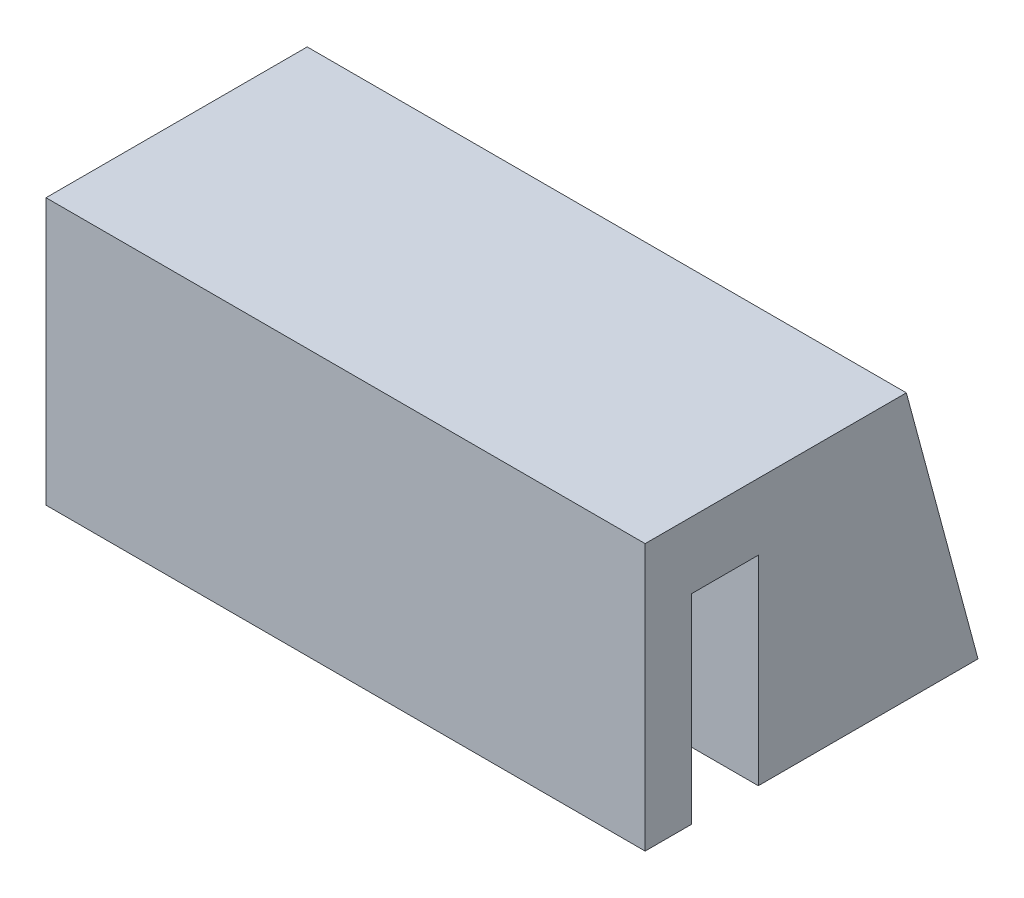
ISO-10303-21;
HEADER;
FILE_DESCRIPTION(('STEP AP214'),'2;1');
FILE_NAME('part.step','',(''),(''),'','','');
FILE_SCHEMA(('AUTOMOTIVE_DESIGN { 1 0 10303 214 1 1 1 1 }'));
ENDSEC;
DATA;
#1=APPLICATION_CONTEXT('core data for automotive mechanical design processes');
#2=APPLICATION_PROTOCOL_DEFINITION('international standard','automotive_design',2000,#1);
#3=PRODUCT_CONTEXT('',#1,'mechanical');
#4=PRODUCT('Part','Part','',(#3));
#5=PRODUCT_RELATED_PRODUCT_CATEGORY('part','',(#4));
#6=PRODUCT_DEFINITION_FORMATION('','',#4);
#7=PRODUCT_DEFINITION_CONTEXT('part definition',#1,'design');
#8=PRODUCT_DEFINITION('design','',#6,#7);
#9=PRODUCT_DEFINITION_SHAPE('','',#8);
#10=(LENGTH_UNIT() NAMED_UNIT(*) SI_UNIT(.MILLI.,.METRE.));
#11=(NAMED_UNIT(*) PLANE_ANGLE_UNIT() SI_UNIT($,.RADIAN.));
#12=(NAMED_UNIT(*) SI_UNIT($,.STERADIAN.) SOLID_ANGLE_UNIT());
#13=UNCERTAINTY_MEASURE_WITH_UNIT(LENGTH_MEASURE(1.E-05),#10,'distance_accuracy_value','');
#14=(GEOMETRIC_REPRESENTATION_CONTEXT(3) GLOBAL_UNCERTAINTY_ASSIGNED_CONTEXT((#13)) GLOBAL_UNIT_ASSIGNED_CONTEXT((#10,
#11,#12)) REPRESENTATION_CONTEXT('',''));
#15=CARTESIAN_POINT('',(0.,0.,0.));
#16=DIRECTION('',(0.,0.,1.));
#17=DIRECTION('',(1.,0.,0.));
#18=AXIS2_PLACEMENT_3D('',#15,#16,#17);
#19=CARTESIAN_POINT('',(-22.5,-10.,25.));
#20=DIRECTION('',(0.,1.,0.));
#21=DIRECTION('',(0.,0.,1.));
#22=AXIS2_PLACEMENT_3D('',#19,#20,#21);
#23=PLANE('',#22);
#24=DIRECTION('',(0.,0.,1.));
#25=VECTOR('',#24,1.);
#26=CARTESIAN_POINT('',(-4.,-10.,0.));
#27=LINE('',#26,#25);
#28=CARTESIAN_POINT('',(-4.,-10.,0.));
#29=VERTEX_POINT('',#28);
#30=CARTESIAN_POINT('',(-4.,-10.,16.5));
#31=VERTEX_POINT('',#30);
#32=EDGE_CURVE('E166',#29,#31,#27,.T.);
#33=ORIENTED_EDGE('',*,*,#32,.T.);
#34=DIRECTION('',(1.,0.,0.));
#35=VECTOR('',#34,1.);
#36=CARTESIAN_POINT('',(-22.5,-10.,16.5));
#37=LINE('',#36,#35);
#38=CARTESIAN_POINT('',(-22.5,-10.,16.5));
#39=VERTEX_POINT('',#38);
#40=EDGE_CURVE('E181',#39,#31,#37,.T.);
#41=ORIENTED_EDGE('',*,*,#40,.F.);
#42=DIRECTION('',(0.,0.,-1.));
#43=VECTOR('',#42,1.);
#44=CARTESIAN_POINT('',(-22.5,-10.,25.));
#45=LINE('',#44,#43);
#46=CARTESIAN_POINT('',(-22.5,-10.,0.));
#47=VERTEX_POINT('',#46);
#48=EDGE_CURVE('E238',#39,#47,#45,.T.);
#49=ORIENTED_EDGE('',*,*,#48,.T.);
#50=DIRECTION('',(1.,0.,0.));
#51=VECTOR('',#50,1.);
#52=CARTESIAN_POINT('',(-22.5,-10.,0.));
#53=LINE('',#52,#51);
#54=EDGE_CURVE('E183',#47,#29,#53,.T.);
#55=ORIENTED_EDGE('',*,*,#54,.T.);
#56=EDGE_LOOP('',(#33,#41,#49,#55));
#57=FACE_BOUND('',#56,.T.);
#58=ADVANCED_FACE('F38',(#57),#23,.F.);
#59=CARTESIAN_POINT('',(19.15,-7.90864992715531,10.9184292781792));
#60=DIRECTION('',(0.,-0.965652581891496,-0.259836662321326));
#61=DIRECTION('',(0.,0.259836662321326,-0.965652581891496));
#62=AXIS2_PLACEMENT_3D('',#59,#60,#61);
#63=PLANE('',#62);
#64=DIRECTION('',(0.,-0.259836662321326,0.965652581891496));
#65=VECTOR('',#64,1.);
#66=CARTESIAN_POINT('',(-4.,-7.90864992715531,10.9184292781792));
#67=LINE('',#66,#65);
#68=CARTESIAN_POINT('',(-4.,-5.31028330394205,1.26190345926421));
#69=VERTEX_POINT('',#68);
#70=CARTESIAN_POINT('',(-4.,-7.90864992715531,10.9184292781792));
#71=VERTEX_POINT('',#70);
#72=EDGE_CURVE('E54',#69,#71,#67,.T.);
#73=ORIENTED_EDGE('',*,*,#72,.F.);
#74=DIRECTION('',(-1.,0.,0.));
#75=VECTOR('',#74,1.);
#76=CARTESIAN_POINT('',(19.15,-5.31028330394205,1.26190345926421));
#77=LINE('',#76,#75);
#78=CARTESIAN_POINT('',(-19.15,-5.31028330394205,1.26190345926421));
#79=VERTEX_POINT('',#78);
#80=EDGE_CURVE('E293',#69,#79,#77,.T.);
#81=ORIENTED_EDGE('',*,*,#80,.T.);
#82=DIRECTION('',(0.,0.259836662321326,-0.965652581891496));
#83=VECTOR('',#82,1.);
#84=CARTESIAN_POINT('',(-19.15,-7.90864992715531,10.9184292781792));
#85=LINE('',#84,#83);
#86=CARTESIAN_POINT('',(-19.15,-7.90864992715531,10.9184292781792));
#87=VERTEX_POINT('',#86);
#88=EDGE_CURVE('E298',#87,#79,#85,.T.);
#89=ORIENTED_EDGE('',*,*,#88,.F.);
#90=DIRECTION('',(-1.,0.,0.));
#91=VECTOR('',#90,1.);
#92=CARTESIAN_POINT('',(19.15,-7.90864992715531,10.9184292781792));
#93=LINE('',#92,#91);
#94=EDGE_CURVE('E273',#71,#87,#93,.T.);
#95=ORIENTED_EDGE('',*,*,#94,.F.);
#96=EDGE_LOOP('',(#73,#81,#89,#95));
#97=FACE_BOUND('',#96,.T.);
#98=ADVANCED_FACE('F415',(#97),#63,.F.);
#99=CARTESIAN_POINT('',(0.,-3.27351753407613,12.1656452573215));
#100=DIRECTION('',(0.,-0.259836662321326,0.965652581891496));
#101=DIRECTION('',(0.,-0.965652581891496,-0.259836662321326));
#102=AXIS2_PLACEMENT_3D('',#99,#100,#101);
#103=PLANE('',#102);
#104=DIRECTION('',(0.,0.965652581891496,0.259836662321326));
#105=VECTOR('',#104,1.);
#106=CARTESIAN_POINT('',(-4.,-3.27351753407613,12.1656452573215));
#107=LINE('',#106,#105);
#108=CARTESIAN_POINT('',(-4.,1.36161485900306,13.4128612364639));
#109=VERTEX_POINT('',#108);
#110=EDGE_CURVE('E47',#71,#109,#107,.T.);
#111=ORIENTED_EDGE('',*,*,#110,.F.);
#112=ORIENTED_EDGE('',*,*,#94,.T.);
#113=DIRECTION('',(0.,0.965652581891496,0.259836662321326));
#114=VECTOR('',#113,1.);
#115=CARTESIAN_POINT('',(-19.15,-7.90864992715531,10.9184292781792));
#116=LINE('',#115,#114);
#117=CARTESIAN_POINT('',(-19.15,1.36161485900306,13.4128612364639));
#118=VERTEX_POINT('',#117);
#119=EDGE_CURVE('E265',#87,#118,#116,.T.);
#120=ORIENTED_EDGE('',*,*,#119,.T.);
#121=DIRECTION('',(1.,0.,0.));
#122=VECTOR('',#121,1.);
#123=CARTESIAN_POINT('',(19.15,1.36161485900306,13.4128612364639));
#124=LINE('',#123,#122);
#125=EDGE_CURVE('E258',#118,#109,#124,.T.);
#126=ORIENTED_EDGE('',*,*,#125,.T.);
#127=EDGE_LOOP('',(#111,#112,#120,#126));
#128=FACE_BOUND('',#127,.T.);
#129=ADVANCED_FACE('F263',(#128),#103,.F.);
#130=DIRECTION('',(1.,0.,0.));
#131=VECTOR('',#130,1.);
#132=CARTESIAN_POINT('',(-22.5,-10.,21.5));
#133=LINE('',#132,#131);
#134=CARTESIAN_POINT('',(-22.5,-10.,21.5));
#135=VERTEX_POINT('',#134);
#136=CARTESIAN_POINT('',(22.5,-10.,21.5));
#137=VERTEX_POINT('',#136);
#138=EDGE_CURVE('E191',#135,#137,#133,.T.);
#139=ORIENTED_EDGE('',*,*,#138,.T.);
#140=DIRECTION('',(0.,0.,-1.));
#141=VECTOR('',#140,1.);
#142=CARTESIAN_POINT('',(22.5,-10.,25.));
#143=LINE('',#142,#141);
#144=CARTESIAN_POINT('',(22.5,-10.,25.));
#145=VERTEX_POINT('',#144);
#146=EDGE_CURVE('E234',#145,#137,#143,.T.);
#147=ORIENTED_EDGE('',*,*,#146,.F.);
#148=DIRECTION('',(1.,0.,0.));
#149=VECTOR('',#148,1.);
#150=CARTESIAN_POINT('',(-22.5,-10.,25.));
#151=LINE('',#150,#149);
#152=CARTESIAN_POINT('',(-22.5,-10.,25.));
#153=VERTEX_POINT('',#152);
#154=EDGE_CURVE('E228',#153,#145,#151,.T.);
#155=ORIENTED_EDGE('',*,*,#154,.F.);
#156=EDGE_CURVE('E239',#153,#135,#45,.T.);
#157=ORIENTED_EDGE('',*,*,#156,.T.);
#158=EDGE_LOOP('',(#139,#147,#155,#157));
#159=FACE_BOUND('',#158,.T.);
#160=ADVANCED_FACE('F414',(#159),#23,.F.);
#161=CARTESIAN_POINT('',(22.5,-10.,25.));
#162=DIRECTION('',(-1.,0.,0.));
#163=DIRECTION('',(0.,0.,1.));
#164=AXIS2_PLACEMENT_3D('',#161,#162,#163);
#165=PLANE('',#164);
#166=CARTESIAN_POINT('',(22.5,-10.,16.5));
#167=VERTEX_POINT('',#166);
#168=CARTESIAN_POINT('',(22.5,-10.,0.));
#169=VERTEX_POINT('',#168);
#170=EDGE_CURVE('E231',#167,#169,#143,.T.);
#171=ORIENTED_EDGE('',*,*,#170,.T.);
#172=DIRECTION('',(0.,-0.965652581891496,-0.259836662321326));
#173=VECTOR('',#172,1.);
#174=CARTESIAN_POINT('',(22.5,10.,5.38157650471693));
#175=LINE('',#174,#173);
#176=CARTESIAN_POINT('',(22.5,10.,5.38157650471693));
#177=VERTEX_POINT('',#176);
#178=EDGE_CURVE('E301',#177,#169,#175,.T.);
#179=ORIENTED_EDGE('',*,*,#178,.F.);
#180=DIRECTION('',(0.,0.,-1.));
#181=VECTOR('',#180,1.);
#182=CARTESIAN_POINT('',(22.5,10.,25.));
#183=LINE('',#182,#181);
#184=CARTESIAN_POINT('',(22.5,10.,25.));
#185=VERTEX_POINT('',#184);
#186=EDGE_CURVE('E247',#185,#177,#183,.T.);
#187=ORIENTED_EDGE('',*,*,#186,.F.);
#188=DIRECTION('',(0.,1.,0.));
#189=VECTOR('',#188,1.);
#190=CARTESIAN_POINT('',(22.5,-10.,25.));
#191=LINE('',#190,#189);
#192=EDGE_CURVE('E218',#145,#185,#191,.T.);
#193=ORIENTED_EDGE('',*,*,#192,.F.);
#194=ORIENTED_EDGE('',*,*,#146,.T.);
#195=DIRECTION('',(0.,-1.,0.));
#196=VECTOR('',#195,1.);
#197=CARTESIAN_POINT('',(22.5,5.,21.5));
#198=LINE('',#197,#196);
#199=CARTESIAN_POINT('',(22.5,5.,21.5));
#200=VERTEX_POINT('',#199);
#201=EDGE_CURVE('E211',#200,#137,#198,.T.);
#202=ORIENTED_EDGE('',*,*,#201,.F.);
#203=DIRECTION('',(0.,0.,-1.));
#204=VECTOR('',#203,1.);
#205=CARTESIAN_POINT('',(22.5,5.,25.));
#206=LINE('',#205,#204);
#207=CARTESIAN_POINT('',(22.5,5.,16.5));
#208=VERTEX_POINT('',#207);
#209=EDGE_CURVE('E322',#200,#208,#206,.T.);
#210=ORIENTED_EDGE('',*,*,#209,.T.);
#211=DIRECTION('',(0.,-1.,0.));
#212=VECTOR('',#211,1.);
#213=CARTESIAN_POINT('',(22.5,5.,16.5));
#214=LINE('',#213,#212);
#215=EDGE_CURVE('E214',#208,#167,#214,.T.);
#216=ORIENTED_EDGE('',*,*,#215,.T.);
#217=EDGE_LOOP('',(#171,#179,#187,#193,#194,#202,#210,#216));
#218=FACE_BOUND('',#217,.T.);
#219=ADVANCED_FACE('F40',(#218),#165,.F.);
#220=CARTESIAN_POINT('',(-22.5,10.,25.));
#221=DIRECTION('',(0.,-1.,0.));
#222=DIRECTION('',(0.,0.,-1.));
#223=AXIS2_PLACEMENT_3D('',#220,#221,#222);
#224=PLANE('',#223);
#225=ORIENTED_EDGE('',*,*,#186,.T.);
#226=DIRECTION('',(1.,0.,0.));
#227=VECTOR('',#226,1.);
#228=CARTESIAN_POINT('',(-43.2113825148424,10.,5.38157650471693));
#229=LINE('',#228,#227);
#230=CARTESIAN_POINT('',(-22.5,10.,5.38157650471693));
#231=VERTEX_POINT('',#230);
#232=EDGE_CURVE('E313',#231,#177,#229,.T.);
#233=ORIENTED_EDGE('',*,*,#232,.F.);
#234=DIRECTION('',(0.,0.,-1.));
#235=VECTOR('',#234,1.);
#236=CARTESIAN_POINT('',(-22.5,10.,25.));
#237=LINE('',#236,#235);
#238=CARTESIAN_POINT('',(-22.5,10.,25.));
#239=VERTEX_POINT('',#238);
#240=EDGE_CURVE('E243',#239,#231,#237,.T.);
#241=ORIENTED_EDGE('',*,*,#240,.F.);
#242=DIRECTION('',(-1.,0.,0.));
#243=VECTOR('',#242,1.);
#244=CARTESIAN_POINT('',(-22.5,10.,25.));
#245=LINE('',#244,#243);
#246=EDGE_CURVE('E222',#185,#239,#245,.T.);
#247=ORIENTED_EDGE('',*,*,#246,.F.);
#248=EDGE_LOOP('',(#225,#233,#241,#247));
#249=FACE_BOUND('',#248,.T.);
#250=ADVANCED_FACE('F358',(#249),#224,.F.);
#251=CARTESIAN_POINT('',(-22.5,-10.,25.));
#252=DIRECTION('',(1.,0.,0.));
#253=DIRECTION('',(0.,0.,-1.));
#254=AXIS2_PLACEMENT_3D('',#251,#252,#253);
#255=PLANE('',#254);
#256=ORIENTED_EDGE('',*,*,#240,.T.);
#257=DIRECTION('',(0.,0.965652581891496,0.259836662321326));
#258=VECTOR('',#257,1.);
#259=CARTESIAN_POINT('',(-22.5,10.,5.38157650471693));
#260=LINE('',#259,#258);
#261=EDGE_CURVE('E199',#47,#231,#260,.T.);
#262=ORIENTED_EDGE('',*,*,#261,.F.);
#263=ORIENTED_EDGE('',*,*,#48,.F.);
#264=DIRECTION('',(0.,-1.,0.));
#265=VECTOR('',#264,1.);
#266=CARTESIAN_POINT('',(-22.5,5.,16.5));
#267=LINE('',#266,#265);
#268=CARTESIAN_POINT('',(-22.5,5.,16.5));
#269=VERTEX_POINT('',#268);
#270=EDGE_CURVE('E189',#269,#39,#267,.T.);
#271=ORIENTED_EDGE('',*,*,#270,.F.);
#272=DIRECTION('',(0.,0.,1.));
#273=VECTOR('',#272,1.);
#274=CARTESIAN_POINT('',(-22.5,5.,25.));
#275=LINE('',#274,#273);
#276=CARTESIAN_POINT('',(-22.5,5.,21.5));
#277=VERTEX_POINT('',#276);
#278=EDGE_CURVE('E201',#269,#277,#275,.T.);
#279=ORIENTED_EDGE('',*,*,#278,.T.);
#280=DIRECTION('',(0.,-1.,0.));
#281=VECTOR('',#280,1.);
#282=CARTESIAN_POINT('',(-22.5,5.,21.5));
#283=LINE('',#282,#281);
#284=EDGE_CURVE('E207',#277,#135,#283,.T.);
#285=ORIENTED_EDGE('',*,*,#284,.T.);
#286=ORIENTED_EDGE('',*,*,#156,.F.);
#287=DIRECTION('',(0.,-1.,0.));
#288=VECTOR('',#287,1.);
#289=CARTESIAN_POINT('',(-22.5,-10.,25.));
#290=LINE('',#289,#288);
#291=EDGE_CURVE('E225',#239,#153,#290,.T.);
#292=ORIENTED_EDGE('',*,*,#291,.F.);
#293=EDGE_LOOP('',(#256,#262,#263,#271,#279,#285,#286,#292));
#294=FACE_BOUND('',#293,.T.);
#295=ADVANCED_FACE('F333',(#294),#255,.F.);
#296=CARTESIAN_POINT('',(15.5,-10.,16.5));
#297=VERTEX_POINT('',#296);
#298=EDGE_CURVE('E192',#297,#167,#37,.T.);
#299=ORIENTED_EDGE('',*,*,#298,.F.);
#300=DIRECTION('',(0.,0.,1.));
#301=VECTOR('',#300,1.);
#302=CARTESIAN_POINT('',(15.5,-10.,0.));
#303=LINE('',#302,#301);
#304=CARTESIAN_POINT('',(15.5,-10.,0.));
#305=VERTEX_POINT('',#304);
#306=EDGE_CURVE('E261',#305,#297,#303,.T.);
#307=ORIENTED_EDGE('',*,*,#306,.F.);
#308=EDGE_CURVE('E206',#305,#169,#53,.T.);
#309=ORIENTED_EDGE('',*,*,#308,.T.);
#310=ORIENTED_EDGE('',*,*,#170,.F.);
#311=EDGE_LOOP('',(#299,#307,#309,#310));
#312=FACE_BOUND('',#311,.T.);
#313=ADVANCED_FACE('F345',(#312),#23,.F.);
#314=CARTESIAN_POINT('',(0.,0.,25.));
#315=DIRECTION('',(0.,0.,-1.));
#316=DIRECTION('',(-1.,0.,0.));
#317=AXIS2_PLACEMENT_3D('',#314,#315,#316);
#318=PLANE('',#317);
#319=ORIENTED_EDGE('',*,*,#192,.T.);
#320=ORIENTED_EDGE('',*,*,#246,.T.);
#321=ORIENTED_EDGE('',*,*,#291,.T.);
#322=ORIENTED_EDGE('',*,*,#154,.T.);
#323=EDGE_LOOP('',(#319,#320,#321,#322));
#324=FACE_BOUND('',#323,.T.);
#325=ADVANCED_FACE('F428',(#324),#318,.F.);
#326=CARTESIAN_POINT('',(-22.5,5.,16.5));
#327=DIRECTION('',(0.,0.,-1.));
#328=DIRECTION('',(-1.,0.,0.));
#329=AXIS2_PLACEMENT_3D('',#326,#327,#328);
#330=PLANE('',#329);
#331=DIRECTION('',(-1.,0.,0.));
#332=VECTOR('',#331,1.);
#333=CARTESIAN_POINT('',(0.,0.530931187170722,16.5));
#334=LINE('',#333,#332);
#335=CARTESIAN_POINT('',(15.5,0.530931187170717,16.5));
#336=VERTEX_POINT('',#335);
#337=CARTESIAN_POINT('',(-4.,0.530931187170722,16.5));
#338=VERTEX_POINT('',#337);
#339=EDGE_CURVE('E175',#336,#338,#334,.T.);
#340=ORIENTED_EDGE('',*,*,#339,.F.);
#341=DIRECTION('',(0.,-1.,0.));
#342=VECTOR('',#341,1.);
#343=CARTESIAN_POINT('',(15.5,28.7492013329767,16.5));
#344=LINE('',#343,#342);
#345=EDGE_CURVE('E390',#336,#297,#344,.T.);
#346=ORIENTED_EDGE('',*,*,#345,.T.);
#347=ORIENTED_EDGE('',*,*,#298,.T.);
#348=ORIENTED_EDGE('',*,*,#215,.F.);
#349=DIRECTION('',(1.,0.,0.));
#350=VECTOR('',#349,1.);
#351=CARTESIAN_POINT('',(-22.5,5.,16.5));
#352=LINE('',#351,#350);
#353=EDGE_CURVE('E197',#269,#208,#352,.T.);
#354=ORIENTED_EDGE('',*,*,#353,.F.);
#355=ORIENTED_EDGE('',*,*,#270,.T.);
#356=ORIENTED_EDGE('',*,*,#40,.T.);
#357=DIRECTION('',(0.,-1.,0.));
#358=VECTOR('',#357,1.);
#359=CARTESIAN_POINT('',(-4.,28.7492013329767,16.5));
#360=LINE('',#359,#358);
#361=EDGE_CURVE('E163',#338,#31,#360,.T.);
#362=ORIENTED_EDGE('',*,*,#361,.F.);
#363=EDGE_LOOP('',(#340,#346,#347,#348,#354,#355,#356,#362));
#364=FACE_BOUND('',#363,.T.);
#365=ADVANCED_FACE('F186',(#364),#330,.F.);
#366=CARTESIAN_POINT('',(-22.5,5.,21.5));
#367=DIRECTION('',(0.,0.,-1.));
#368=DIRECTION('',(-1.,0.,0.));
#369=AXIS2_PLACEMENT_3D('',#366,#367,#368);
#370=PLANE('',#369);
#371=ORIENTED_EDGE('',*,*,#138,.F.);
#372=ORIENTED_EDGE('',*,*,#284,.F.);
#373=DIRECTION('',(1.,0.,0.));
#374=VECTOR('',#373,1.);
#375=CARTESIAN_POINT('',(-22.5,5.,21.5));
#376=LINE('',#375,#374);
#377=EDGE_CURVE('E325',#277,#200,#376,.T.);
#378=ORIENTED_EDGE('',*,*,#377,.T.);
#379=ORIENTED_EDGE('',*,*,#201,.T.);
#380=EDGE_LOOP('',(#371,#372,#378,#379));
#381=FACE_BOUND('',#380,.T.);
#382=ADVANCED_FACE('F457',(#381),#370,.T.);
#383=CARTESIAN_POINT('',(0.,5.,0.));
#384=DIRECTION('',(0.,1.,0.));
#385=DIRECTION('',(0.,0.,1.));
#386=AXIS2_PLACEMENT_3D('',#383,#384,#385);
#387=PLANE('',#386);
#388=ORIENTED_EDGE('',*,*,#353,.T.);
#389=ORIENTED_EDGE('',*,*,#209,.F.);
#390=ORIENTED_EDGE('',*,*,#377,.F.);
#391=ORIENTED_EDGE('',*,*,#278,.F.);
#392=EDGE_LOOP('',(#388,#389,#390,#391));
#393=FACE_BOUND('',#392,.T.);
#394=ADVANCED_FACE('F336',(#393),#387,.F.);
#395=CARTESIAN_POINT('',(-43.2113825148424,10.,5.38157650471693));
#396=DIRECTION('',(0.,-0.259836662321326,0.965652581891496));
#397=DIRECTION('',(0.,-0.965652581891496,-0.259836662321326));
#398=AXIS2_PLACEMENT_3D('',#395,#396,#397);
#399=PLANE('',#398);
#400=ORIENTED_EDGE('',*,*,#308,.F.);
#401=DIRECTION('',(0.,0.965652581891496,0.259836662321326));
#402=VECTOR('',#401,1.);
#403=CARTESIAN_POINT('',(15.5,10.,5.38157650471693));
#404=LINE('',#403,#402);
#405=CARTESIAN_POINT('',(15.5,-5.31028330394205,1.26190345926421));
#406=VERTEX_POINT('',#405);
#407=EDGE_CURVE('E286',#305,#406,#404,.T.);
#408=ORIENTED_EDGE('',*,*,#407,.T.);
#409=CARTESIAN_POINT('',(19.15,-5.31028330394205,1.26190345926421));
#410=VERTEX_POINT('',#409);
#411=EDGE_CURVE('E294',#410,#406,#77,.T.);
#412=ORIENTED_EDGE('',*,*,#411,.F.);
#413=DIRECTION('',(0.,-0.965652581891496,-0.259836662321326));
#414=VECTOR('',#413,1.);
#415=CARTESIAN_POINT('',(19.15,-5.31028330394205,1.26190345926421));
#416=LINE('',#415,#414);
#417=CARTESIAN_POINT('',(19.15,3.95998148221632,3.75633541754894));
#418=VERTEX_POINT('',#417);
#419=EDGE_CURVE('E289',#418,#410,#416,.T.);
#420=ORIENTED_EDGE('',*,*,#419,.F.);
#421=DIRECTION('',(1.,0.,0.));
#422=VECTOR('',#421,1.);
#423=CARTESIAN_POINT('',(19.15,3.95998148221632,3.75633541754894));
#424=LINE('',#423,#422);
#425=CARTESIAN_POINT('',(-19.15,3.95998148221631,3.75633541754893));
#426=VERTEX_POINT('',#425);
#427=EDGE_CURVE('E285',#426,#418,#424,.T.);
#428=ORIENTED_EDGE('',*,*,#427,.F.);
#429=DIRECTION('',(0.,0.965652581891496,0.259836662321326));
#430=VECTOR('',#429,1.);
#431=CARTESIAN_POINT('',(-19.15,-5.31028330394205,1.26190345926421));
#432=LINE('',#431,#430);
#433=EDGE_CURVE('E62',#79,#426,#432,.T.);
#434=ORIENTED_EDGE('',*,*,#433,.F.);
#435=ORIENTED_EDGE('',*,*,#80,.F.);
#436=DIRECTION('',(0.,0.965652581891496,0.259836662321326));
#437=VECTOR('',#436,1.);
#438=CARTESIAN_POINT('',(-4.,10.,5.38157650471693));
#439=LINE('',#438,#437);
#440=EDGE_CURVE('E383',#29,#69,#439,.T.);
#441=ORIENTED_EDGE('',*,*,#440,.F.);
#442=ORIENTED_EDGE('',*,*,#54,.F.);
#443=ORIENTED_EDGE('',*,*,#261,.T.);
#444=ORIENTED_EDGE('',*,*,#232,.T.);
#445=ORIENTED_EDGE('',*,*,#178,.T.);
#446=EDGE_LOOP('',(#400,#408,#412,#420,#428,#434,#435,#441,#442,#443,#444,#445));
#447=FACE_BOUND('',#446,.T.);
#448=ADVANCED_FACE('F356',(#447),#399,.F.);
#449=CARTESIAN_POINT('',(-19.15,-7.90864992715531,10.9184292781792));
#450=DIRECTION('',(-1.,0.,0.));
#451=DIRECTION('',(0.,0.,1.));
#452=AXIS2_PLACEMENT_3D('',#449,#450,#451);
#453=PLANE('',#452);
#454=ORIENTED_EDGE('',*,*,#433,.T.);
#455=DIRECTION('',(0.,0.259836662321326,-0.965652581891496));
#456=VECTOR('',#455,1.);
#457=CARTESIAN_POINT('',(-19.15,1.36161485900306,13.4128612364639));
#458=LINE('',#457,#456);
#459=EDGE_CURVE('E282',#118,#426,#458,.T.);
#460=ORIENTED_EDGE('',*,*,#459,.F.);
#461=ORIENTED_EDGE('',*,*,#119,.F.);
#462=ORIENTED_EDGE('',*,*,#88,.T.);
#463=EDGE_LOOP('',(#454,#460,#461,#462));
#464=FACE_BOUND('',#463,.T.);
#465=ADVANCED_FACE('F377',(#464),#453,.F.);
#466=ORIENTED_EDGE('',*,*,#411,.T.);
#467=DIRECTION('',(0.,-0.259836662321326,0.965652581891496));
#468=VECTOR('',#467,1.);
#469=CARTESIAN_POINT('',(15.5,-7.90864992715531,10.9184292781792));
#470=LINE('',#469,#468);
#471=CARTESIAN_POINT('',(15.5,-7.90864992715531,10.9184292781792));
#472=VERTEX_POINT('',#471);
#473=EDGE_CURVE('E366',#406,#472,#470,.T.);
#474=ORIENTED_EDGE('',*,*,#473,.T.);
#475=CARTESIAN_POINT('',(19.15,-7.90864992715531,10.9184292781792));
#476=VERTEX_POINT('',#475);
#477=EDGE_CURVE('E278',#476,#472,#93,.T.);
#478=ORIENTED_EDGE('',*,*,#477,.F.);
#479=DIRECTION('',(0.,0.259836662321326,-0.965652581891496));
#480=VECTOR('',#479,1.);
#481=CARTESIAN_POINT('',(19.15,-7.90864992715531,10.9184292781792));
#482=LINE('',#481,#480);
#483=EDGE_CURVE('E302',#476,#410,#482,.T.);
#484=ORIENTED_EDGE('',*,*,#483,.T.);
#485=EDGE_LOOP('',(#466,#474,#478,#484));
#486=FACE_BOUND('',#485,.T.);
#487=ADVANCED_FACE('F369',(#486),#63,.F.);
#488=CARTESIAN_POINT('',(19.15,-7.90864992715531,10.9184292781792));
#489=DIRECTION('',(1.,0.,0.));
#490=DIRECTION('',(0.,0.,-1.));
#491=AXIS2_PLACEMENT_3D('',#488,#489,#490);
#492=PLANE('',#491);
#493=ORIENTED_EDGE('',*,*,#419,.T.);
#494=ORIENTED_EDGE('',*,*,#483,.F.);
#495=DIRECTION('',(0.,-0.965652581891496,-0.259836662321326));
#496=VECTOR('',#495,1.);
#497=CARTESIAN_POINT('',(19.15,-7.90864992715531,10.9184292781792));
#498=LINE('',#497,#496);
#499=CARTESIAN_POINT('',(19.15,1.36161485900306,13.4128612364639));
#500=VERTEX_POINT('',#499);
#501=EDGE_CURVE('E267',#500,#476,#498,.T.);
#502=ORIENTED_EDGE('',*,*,#501,.F.);
#503=DIRECTION('',(0.,0.259836662321326,-0.965652581891496));
#504=VECTOR('',#503,1.);
#505=CARTESIAN_POINT('',(19.15,1.36161485900306,13.4128612364639));
#506=LINE('',#505,#504);
#507=EDGE_CURVE('E305',#500,#418,#506,.T.);
#508=ORIENTED_EDGE('',*,*,#507,.T.);
#509=EDGE_LOOP('',(#493,#494,#502,#508));
#510=FACE_BOUND('',#509,.T.);
#511=ADVANCED_FACE('F373',(#510),#492,.F.);
#512=CARTESIAN_POINT('',(19.15,1.36161485900306,13.4128612364639));
#513=DIRECTION('',(0.,0.965652581891496,0.259836662321326));
#514=DIRECTION('',(0.,-0.259836662321326,0.965652581891496));
#515=AXIS2_PLACEMENT_3D('',#512,#513,#514);
#516=PLANE('',#515);
#517=CARTESIAN_POINT('',(15.5,1.36161485900305,13.4128612364639));
#518=VERTEX_POINT('',#517);
#519=EDGE_CURVE('E268',#518,#500,#124,.T.);
#520=ORIENTED_EDGE('',*,*,#519,.F.);
#521=DIRECTION('',(0.,-0.259836662321326,0.965652581891496));
#522=VECTOR('',#521,1.);
#523=CARTESIAN_POINT('',(15.5,6.57613733973309,-5.96630201118122));
#524=LINE('',#523,#522);
#525=EDGE_CURVE('E393',#518,#336,#524,.T.);
#526=ORIENTED_EDGE('',*,*,#525,.T.);
#527=ORIENTED_EDGE('',*,*,#339,.T.);
#528=DIRECTION('',(0.,-0.259836662321326,0.965652581891496));
#529=VECTOR('',#528,1.);
#530=CARTESIAN_POINT('',(-4.,6.5761373397331,-5.96630201118122));
#531=LINE('',#530,#529);
#532=EDGE_CURVE('E169',#109,#338,#531,.T.);
#533=ORIENTED_EDGE('',*,*,#532,.F.);
#534=ORIENTED_EDGE('',*,*,#125,.F.);
#535=ORIENTED_EDGE('',*,*,#459,.T.);
#536=ORIENTED_EDGE('',*,*,#427,.T.);
#537=ORIENTED_EDGE('',*,*,#507,.F.);
#538=EDGE_LOOP('',(#520,#526,#527,#533,#534,#535,#536,#537));
#539=FACE_BOUND('',#538,.T.);
#540=ADVANCED_FACE('F257',(#539),#516,.F.);
#541=ORIENTED_EDGE('',*,*,#477,.T.);
#542=DIRECTION('',(0.,0.965652581891496,0.259836662321326));
#543=VECTOR('',#542,1.);
#544=CARTESIAN_POINT('',(15.5,-3.27351753407612,12.1656452573215));
#545=LINE('',#544,#543);
#546=EDGE_CURVE('E11',#472,#518,#545,.T.);
#547=ORIENTED_EDGE('',*,*,#546,.T.);
#548=ORIENTED_EDGE('',*,*,#519,.T.);
#549=ORIENTED_EDGE('',*,*,#501,.T.);
#550=EDGE_LOOP('',(#541,#547,#548,#549));
#551=FACE_BOUND('',#550,.T.);
#552=ADVANCED_FACE('F401',(#551),#103,.F.);
#553=CARTESIAN_POINT('',(15.5,28.7492013329767,0.));
#554=DIRECTION('',(1.,0.,0.));
#555=DIRECTION('',(0.,0.,-1.));
#556=AXIS2_PLACEMENT_3D('',#553,#554,#555);
#557=PLANE('',#556);
#558=ORIENTED_EDGE('',*,*,#306,.T.);
#559=ORIENTED_EDGE('',*,*,#345,.F.);
#560=ORIENTED_EDGE('',*,*,#525,.F.);
#561=ORIENTED_EDGE('',*,*,#546,.F.);
#562=ORIENTED_EDGE('',*,*,#473,.F.);
#563=ORIENTED_EDGE('',*,*,#407,.F.);
#564=EDGE_LOOP('',(#558,#559,#560,#561,#562,#563));
#565=FACE_BOUND('',#564,.T.);
#566=ADVANCED_FACE('F399',(#565),#557,.F.);
#567=CARTESIAN_POINT('',(-4.,28.7492013329767,0.));
#568=DIRECTION('',(1.,0.,0.));
#569=DIRECTION('',(0.,0.,-1.));
#570=AXIS2_PLACEMENT_3D('',#567,#568,#569);
#571=PLANE('',#570);
#572=ORIENTED_EDGE('',*,*,#440,.T.);
#573=ORIENTED_EDGE('',*,*,#72,.T.);
#574=ORIENTED_EDGE('',*,*,#110,.T.);
#575=ORIENTED_EDGE('',*,*,#532,.T.);
#576=ORIENTED_EDGE('',*,*,#361,.T.);
#577=ORIENTED_EDGE('',*,*,#32,.F.);
#578=EDGE_LOOP('',(#572,#573,#574,#575,#576,#577));
#579=FACE_BOUND('',#578,.T.);
#580=ADVANCED_FACE('F165',(#579),#571,.T.);
#581=CLOSED_SHELL('',(#58,#98,#129,#160,#219,#250,#295,#313,#325,#365,#382,#394,#448,#465,#487,
#511,#540,#552,#566,#580));
#582=MANIFOLD_SOLID_BREP('B2',#581);
#583=ADVANCED_BREP_SHAPE_REPRESENTATION('',(#18,#582),#14);
#584=SHAPE_DEFINITION_REPRESENTATION(#9,#583);
ENDSEC;
END-ISO-10303-21;
